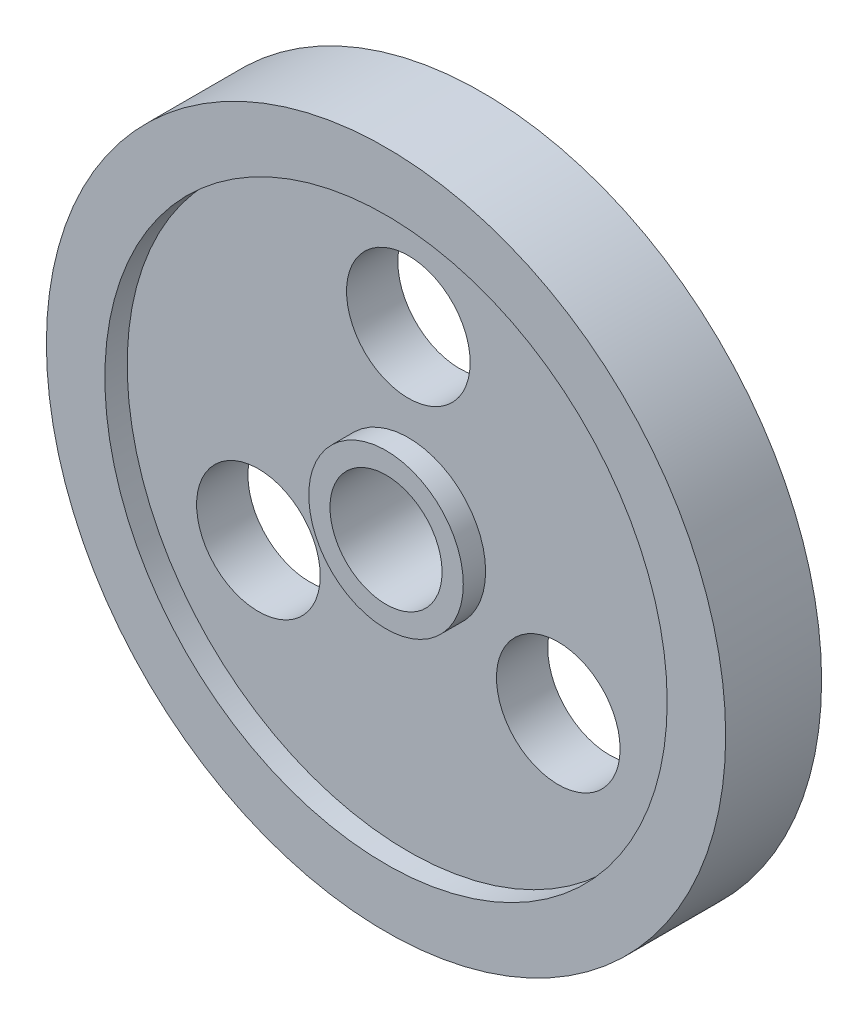
ISO-10303-21;
HEADER;
FILE_DESCRIPTION(('STEP AP214'),'2;1');
FILE_NAME('part.step','',(''),(''),'','','');
FILE_SCHEMA(('AUTOMOTIVE_DESIGN { 1 0 10303 214 1 1 1 1 }'));
ENDSEC;
DATA;
#1=APPLICATION_CONTEXT('core data for automotive mechanical design processes');
#2=APPLICATION_PROTOCOL_DEFINITION('international standard','automotive_design',2000,#1);
#3=PRODUCT_CONTEXT('',#1,'mechanical');
#4=PRODUCT('Part','Part','',(#3));
#5=PRODUCT_RELATED_PRODUCT_CATEGORY('part','',(#4));
#6=PRODUCT_DEFINITION_FORMATION('','',#4);
#7=PRODUCT_DEFINITION_CONTEXT('part definition',#1,'design');
#8=PRODUCT_DEFINITION('design','',#6,#7);
#9=PRODUCT_DEFINITION_SHAPE('','',#8);
#10=(LENGTH_UNIT() NAMED_UNIT(*) SI_UNIT(.MILLI.,.METRE.));
#11=(NAMED_UNIT(*) PLANE_ANGLE_UNIT() SI_UNIT($,.RADIAN.));
#12=(NAMED_UNIT(*) SI_UNIT($,.STERADIAN.) SOLID_ANGLE_UNIT());
#13=UNCERTAINTY_MEASURE_WITH_UNIT(LENGTH_MEASURE(1.E-05),#10,'distance_accuracy_value','');
#14=(GEOMETRIC_REPRESENTATION_CONTEXT(3) GLOBAL_UNCERTAINTY_ASSIGNED_CONTEXT((#13)) GLOBAL_UNIT_ASSIGNED_CONTEXT((#10,
#11,#12)) REPRESENTATION_CONTEXT('',''));
#15=CARTESIAN_POINT('',(0.,0.,0.));
#16=DIRECTION('',(0.,0.,1.));
#17=DIRECTION('',(1.,0.,0.));
#18=AXIS2_PLACEMENT_3D('',#15,#16,#17);
#19=CARTESIAN_POINT('',(0.,0.,-2.794));
#20=DIRECTION('',(0.,0.,1.));
#21=DIRECTION('',(1.,0.,0.));
#22=AXIS2_PLACEMENT_3D('',#19,#20,#21);
#23=PLANE('',#22);
#24=CARTESIAN_POINT('',(0.,0.,-2.794));
#25=DIRECTION('',(0.,0.,1.));
#26=DIRECTION('',(1.,0.,0.));
#27=AXIS2_PLACEMENT_3D('',#24,#25,#26);
#28=CIRCLE('',#27,3.2639);
#29=CARTESIAN_POINT('',(3.2639,0.,-2.794));
#30=VERTEX_POINT('',#29);
#31=EDGE_CURVE('E61',#30,#30,#28,.T.);
#32=ORIENTED_EDGE('',*,*,#31,.T.);
#33=EDGE_LOOP('',(#32));
#34=FACE_BOUND('',#33,.T.);
#35=CARTESIAN_POINT('',(0.,0.,-2.794));
#36=DIRECTION('',(0.,0.,1.));
#37=DIRECTION('',(1.,0.,0.));
#38=AXIS2_PLACEMENT_3D('',#35,#36,#37);
#39=CIRCLE('',#38,4.5);
#40=CARTESIAN_POINT('',(4.5,0.,-2.794));
#41=VERTEX_POINT('',#40);
#42=EDGE_CURVE('E75',#41,#41,#39,.T.);
#43=ORIENTED_EDGE('',*,*,#42,.F.);
#44=EDGE_LOOP('',(#43));
#45=FACE_BOUND('',#44,.T.);
#46=ADVANCED_FACE('F41',(#34,#45),#23,.F.);
#47=CARTESIAN_POINT('',(0.,0.,2.794));
#48=DIRECTION('',(0.,0.,1.));
#49=DIRECTION('',(1.,0.,0.));
#50=AXIS2_PLACEMENT_3D('',#47,#48,#49);
#51=PLANE('',#50);
#52=CARTESIAN_POINT('',(0.,0.,2.794));
#53=DIRECTION('',(0.,0.,1.));
#54=DIRECTION('',(1.,0.,0.));
#55=AXIS2_PLACEMENT_3D('',#52,#53,#54);
#56=CIRCLE('',#55,3.2639);
#57=CARTESIAN_POINT('',(3.2639,0.,2.794));
#58=VERTEX_POINT('',#57);
#59=EDGE_CURVE('E58',#58,#58,#56,.T.);
#60=ORIENTED_EDGE('',*,*,#59,.F.);
#61=EDGE_LOOP('',(#60));
#62=FACE_BOUND('',#61,.T.);
#63=CARTESIAN_POINT('',(0.,0.,2.794));
#64=DIRECTION('',(0.,0.,1.));
#65=DIRECTION('',(1.,0.,0.));
#66=AXIS2_PLACEMENT_3D('',#63,#64,#65);
#67=CIRCLE('',#66,4.5);
#68=CARTESIAN_POINT('',(4.5,0.,2.794));
#69=VERTEX_POINT('',#68);
#70=EDGE_CURVE('E95',#69,#69,#67,.T.);
#71=ORIENTED_EDGE('',*,*,#70,.T.);
#72=EDGE_LOOP('',(#71));
#73=FACE_BOUND('',#72,.T.);
#74=ADVANCED_FACE('F137',(#62,#73),#51,.T.);
#75=CARTESIAN_POINT('',(0.,0.,2.794));
#76=DIRECTION('',(0.,0.,1.));
#77=DIRECTION('',(1.,0.,0.));
#78=AXIS2_PLACEMENT_3D('',#75,#76,#77);
#79=CIRCLE('',#78,16.375);
#80=CARTESIAN_POINT('',(16.375,0.,2.794));
#81=VERTEX_POINT('',#80);
#82=EDGE_CURVE('E103',#81,#81,#79,.T.);
#83=ORIENTED_EDGE('',*,*,#82,.F.);
#84=EDGE_LOOP('',(#83));
#85=FACE_BOUND('',#84,.T.);
#86=CARTESIAN_POINT('',(0.,0.,2.794));
#87=DIRECTION('',(0.,0.,1.));
#88=DIRECTION('',(1.,0.,0.));
#89=AXIS2_PLACEMENT_3D('',#86,#87,#88);
#90=CIRCLE('',#89,19.78095238);
#91=CARTESIAN_POINT('',(19.78095238,0.,2.794));
#92=VERTEX_POINT('',#91);
#93=EDGE_CURVE('E10',#92,#92,#90,.T.);
#94=ORIENTED_EDGE('',*,*,#93,.T.);
#95=EDGE_LOOP('',(#94));
#96=FACE_BOUND('',#95,.T.);
#97=ADVANCED_FACE('F143',(#85,#96),#51,.T.);
#98=CARTESIAN_POINT('',(0.,0.,-2.794));
#99=DIRECTION('',(0.,0.,1.));
#100=DIRECTION('',(1.,0.,0.));
#101=AXIS2_PLACEMENT_3D('',#98,#99,#100);
#102=CIRCLE('',#101,16.375);
#103=CARTESIAN_POINT('',(16.375,0.,-2.794));
#104=VERTEX_POINT('',#103);
#105=EDGE_CURVE('E87',#104,#104,#102,.T.);
#106=ORIENTED_EDGE('',*,*,#105,.T.);
#107=EDGE_LOOP('',(#106));
#108=FACE_BOUND('',#107,.T.);
#109=CARTESIAN_POINT('',(0.,0.,-2.794));
#110=DIRECTION('',(0.,0.,1.));
#111=DIRECTION('',(1.,0.,0.));
#112=AXIS2_PLACEMENT_3D('',#109,#110,#111);
#113=CIRCLE('',#112,19.78095238);
#114=CARTESIAN_POINT('',(19.78095238,0.,-2.794));
#115=VERTEX_POINT('',#114);
#116=EDGE_CURVE('E50',#115,#115,#113,.T.);
#117=ORIENTED_EDGE('',*,*,#116,.F.);
#118=EDGE_LOOP('',(#117));
#119=FACE_BOUND('',#118,.T.);
#120=ADVANCED_FACE('F133',(#108,#119),#23,.F.);
#121=CARTESIAN_POINT('',(0.,0.,2.794));
#122=DIRECTION('',(0.,0.,-1.));
#123=DIRECTION('',(-1.,0.,0.));
#124=AXIS2_PLACEMENT_3D('',#121,#122,#123);
#125=CYLINDRICAL_SURFACE('',#124,19.78095238);
#126=ORIENTED_EDGE('',*,*,#93,.F.);
#127=EDGE_LOOP('',(#126));
#128=FACE_BOUND('',#127,.T.);
#129=ORIENTED_EDGE('',*,*,#116,.T.);
#130=EDGE_LOOP('',(#129));
#131=FACE_BOUND('',#130,.T.);
#132=ADVANCED_FACE('F43',(#128,#131),#125,.T.);
#133=CARTESIAN_POINT('',(0.,0.,2.794));
#134=DIRECTION('',(0.,0.,-1.));
#135=DIRECTION('',(-1.,0.,0.));
#136=AXIS2_PLACEMENT_3D('',#133,#134,#135);
#137=CYLINDRICAL_SURFACE('',#136,3.2639);
#138=ORIENTED_EDGE('',*,*,#59,.T.);
#139=EDGE_LOOP('',(#138));
#140=FACE_BOUND('',#139,.T.);
#141=ORIENTED_EDGE('',*,*,#31,.F.);
#142=EDGE_LOOP('',(#141));
#143=FACE_BOUND('',#142,.T.);
#144=ADVANCED_FACE('F120',(#140,#143),#137,.F.);
#145=CARTESIAN_POINT('',(0.,0.,1.494));
#146=DIRECTION('',(0.,0.,1.));
#147=DIRECTION('',(1.,0.,0.));
#148=AXIS2_PLACEMENT_3D('',#145,#146,#147);
#149=CYLINDRICAL_SURFACE('',#148,16.375);
#150=CARTESIAN_POINT('',(0.,0.,1.494));
#151=DIRECTION('',(0.,0.,1.));
#152=DIRECTION('',(1.,0.,0.));
#153=AXIS2_PLACEMENT_3D('',#150,#151,#152);
#154=CIRCLE('',#153,16.375);
#155=CARTESIAN_POINT('',(16.375,0.,1.494));
#156=VERTEX_POINT('',#155);
#157=EDGE_CURVE('E107',#156,#156,#154,.T.);
#158=ORIENTED_EDGE('',*,*,#157,.F.);
#159=EDGE_LOOP('',(#158));
#160=FACE_BOUND('',#159,.T.);
#161=ORIENTED_EDGE('',*,*,#82,.T.);
#162=EDGE_LOOP('',(#161));
#163=FACE_BOUND('',#162,.T.);
#164=ADVANCED_FACE('F122',(#160,#163),#149,.F.);
#165=CARTESIAN_POINT('',(0.,0.,1.494));
#166=DIRECTION('',(0.,0.,1.));
#167=DIRECTION('',(1.,0.,0.));
#168=AXIS2_PLACEMENT_3D('',#165,#166,#167);
#169=PLANE('',#168);
#170=CARTESIAN_POINT('',(-8.731699961,-5.04124932296639,1.494));
#171=DIRECTION('',(0.,0.,1.));
#172=DIRECTION('',(1.,0.,0.));
#173=AXIS2_PLACEMENT_3D('',#170,#171,#172);
#174=CIRCLE('',#173,3.600000039);
#175=CARTESIAN_POINT('',(-5.131699922,-5.04124932296639,1.494));
#176=VERTEX_POINT('',#175);
#177=EDGE_CURVE('E68',#176,#176,#174,.T.);
#178=ORIENTED_EDGE('',*,*,#177,.F.);
#179=EDGE_LOOP('',(#178));
#180=FACE_BOUND('',#179,.T.);
#181=CARTESIAN_POINT('',(8.731699961,-5.04124932296639,1.494));
#182=DIRECTION('',(0.,0.,1.));
#183=DIRECTION('',(1.,0.,0.));
#184=AXIS2_PLACEMENT_3D('',#181,#182,#183);
#185=CIRCLE('',#184,3.60000003900001);
#186=CARTESIAN_POINT('',(12.3317,-5.04124932296639,1.494));
#187=VERTEX_POINT('',#186);
#188=EDGE_CURVE('E183',#187,#187,#185,.T.);
#189=ORIENTED_EDGE('',*,*,#188,.F.);
#190=EDGE_LOOP('',(#189));
#191=FACE_BOUND('',#190,.T.);
#192=CARTESIAN_POINT('',(0.,10.0824986459328,1.494));
#193=DIRECTION('',(0.,0.,1.));
#194=DIRECTION('',(1.,0.,0.));
#195=AXIS2_PLACEMENT_3D('',#192,#193,#194);
#196=CIRCLE('',#195,3.60000003900001);
#197=CARTESIAN_POINT('',(3.60000003900001,10.0824986459328,1.494));
#198=VERTEX_POINT('',#197);
#199=EDGE_CURVE('E187',#198,#198,#196,.T.);
#200=ORIENTED_EDGE('',*,*,#199,.F.);
#201=EDGE_LOOP('',(#200));
#202=FACE_BOUND('',#201,.T.);
#203=CARTESIAN_POINT('',(0.,0.,1.494));
#204=DIRECTION('',(0.,0.,1.));
#205=DIRECTION('',(1.,0.,0.));
#206=AXIS2_PLACEMENT_3D('',#203,#204,#205);
#207=CIRCLE('',#206,4.5);
#208=CARTESIAN_POINT('',(4.5,0.,1.494));
#209=VERTEX_POINT('',#208);
#210=EDGE_CURVE('E99',#209,#209,#207,.T.);
#211=ORIENTED_EDGE('',*,*,#210,.F.);
#212=EDGE_LOOP('',(#211));
#213=FACE_BOUND('',#212,.T.);
#214=ORIENTED_EDGE('',*,*,#157,.T.);
#215=EDGE_LOOP('',(#214));
#216=FACE_BOUND('',#215,.T.);
#217=ADVANCED_FACE('F129',(#180,#191,#202,#213,#216),#169,.T.);
#218=CARTESIAN_POINT('',(0.,0.,1.494));
#219=DIRECTION('',(0.,0.,1.));
#220=DIRECTION('',(1.,0.,0.));
#221=AXIS2_PLACEMENT_3D('',#218,#219,#220);
#222=CYLINDRICAL_SURFACE('',#221,4.5);
#223=ORIENTED_EDGE('',*,*,#210,.T.);
#224=EDGE_LOOP('',(#223));
#225=FACE_BOUND('',#224,.T.);
#226=ORIENTED_EDGE('',*,*,#70,.F.);
#227=EDGE_LOOP('',(#226));
#228=FACE_BOUND('',#227,.T.);
#229=ADVANCED_FACE('F167',(#225,#228),#222,.T.);
#230=CARTESIAN_POINT('',(0.,0.,-1.494));
#231=DIRECTION('',(0.,0.,-1.));
#232=DIRECTION('',(1.,0.,0.));
#233=AXIS2_PLACEMENT_3D('',#230,#231,#232);
#234=PLANE('',#233);
#235=CARTESIAN_POINT('',(-8.731699961,-5.04124932296639,-1.494));
#236=DIRECTION('',(0.,0.,-1.));
#237=DIRECTION('',(-1.,0.,0.));
#238=AXIS2_PLACEMENT_3D('',#235,#236,#237);
#239=CIRCLE('',#238,3.600000039);
#240=CARTESIAN_POINT('',(-12.3317,-5.04124932296639,-1.494));
#241=VERTEX_POINT('',#240);
#242=EDGE_CURVE('E45',#241,#241,#239,.T.);
#243=ORIENTED_EDGE('',*,*,#242,.F.);
#244=EDGE_LOOP('',(#243));
#245=FACE_BOUND('',#244,.T.);
#246=CARTESIAN_POINT('',(8.731699961,-5.04124932296639,-1.494));
#247=DIRECTION('',(0.,0.,-1.));
#248=DIRECTION('',(-1.,0.,0.));
#249=AXIS2_PLACEMENT_3D('',#246,#247,#248);
#250=CIRCLE('',#249,3.60000003900001);
#251=CARTESIAN_POINT('',(5.13169992199999,-5.04124932296639,-1.494));
#252=VERTEX_POINT('',#251);
#253=EDGE_CURVE('E67',#252,#252,#250,.T.);
#254=ORIENTED_EDGE('',*,*,#253,.F.);
#255=EDGE_LOOP('',(#254));
#256=FACE_BOUND('',#255,.T.);
#257=CARTESIAN_POINT('',(0.,10.0824986459328,-1.494));
#258=DIRECTION('',(0.,0.,-1.));
#259=DIRECTION('',(-1.,0.,0.));
#260=AXIS2_PLACEMENT_3D('',#257,#258,#259);
#261=CIRCLE('',#260,3.60000003900001);
#262=CARTESIAN_POINT('',(-3.60000003900001,10.0824986459328,-1.494));
#263=VERTEX_POINT('',#262);
#264=EDGE_CURVE('E64',#263,#263,#261,.T.);
#265=ORIENTED_EDGE('',*,*,#264,.F.);
#266=EDGE_LOOP('',(#265));
#267=FACE_BOUND('',#266,.T.);
#268=CARTESIAN_POINT('',(0.,0.,-1.494));
#269=DIRECTION('',(0.,0.,1.));
#270=DIRECTION('',(1.,0.,0.));
#271=AXIS2_PLACEMENT_3D('',#268,#269,#270);
#272=CIRCLE('',#271,16.375);
#273=CARTESIAN_POINT('',(16.375,0.,-1.494));
#274=VERTEX_POINT('',#273);
#275=EDGE_CURVE('E91',#274,#274,#272,.T.);
#276=ORIENTED_EDGE('',*,*,#275,.F.);
#277=EDGE_LOOP('',(#276));
#278=FACE_BOUND('',#277,.T.);
#279=CARTESIAN_POINT('',(0.,0.,-1.494));
#280=DIRECTION('',(0.,0.,1.));
#281=DIRECTION('',(1.,0.,0.));
#282=AXIS2_PLACEMENT_3D('',#279,#280,#281);
#283=CIRCLE('',#282,4.5);
#284=CARTESIAN_POINT('',(4.5,0.,-1.494));
#285=VERTEX_POINT('',#284);
#286=EDGE_CURVE('E80',#285,#285,#283,.T.);
#287=ORIENTED_EDGE('',*,*,#286,.T.);
#288=EDGE_LOOP('',(#287));
#289=FACE_BOUND('',#288,.T.);
#290=ADVANCED_FACE('F157',(#245,#256,#267,#278,#289),#234,.T.);
#291=CARTESIAN_POINT('',(0.,0.,-1.494));
#292=DIRECTION('',(0.,0.,-1.));
#293=DIRECTION('',(-1.,0.,0.));
#294=AXIS2_PLACEMENT_3D('',#291,#292,#293);
#295=CYLINDRICAL_SURFACE('',#294,16.375);
#296=ORIENTED_EDGE('',*,*,#275,.T.);
#297=EDGE_LOOP('',(#296));
#298=FACE_BOUND('',#297,.T.);
#299=ORIENTED_EDGE('',*,*,#105,.F.);
#300=EDGE_LOOP('',(#299));
#301=FACE_BOUND('',#300,.T.);
#302=ADVANCED_FACE('F154',(#298,#301),#295,.F.);
#303=CARTESIAN_POINT('',(0.,0.,-1.494));
#304=DIRECTION('',(0.,0.,-1.));
#305=DIRECTION('',(-1.,0.,0.));
#306=AXIS2_PLACEMENT_3D('',#303,#304,#305);
#307=CYLINDRICAL_SURFACE('',#306,4.5);
#308=ORIENTED_EDGE('',*,*,#286,.F.);
#309=EDGE_LOOP('',(#308));
#310=FACE_BOUND('',#309,.T.);
#311=ORIENTED_EDGE('',*,*,#42,.T.);
#312=EDGE_LOOP('',(#311));
#313=FACE_BOUND('',#312,.T.);
#314=ADVANCED_FACE('F156',(#310,#313),#307,.T.);
#315=CARTESIAN_POINT('',(0.,10.0824986459328,-2.794));
#316=DIRECTION('',(0.,0.,1.));
#317=DIRECTION('',(1.,0.,0.));
#318=AXIS2_PLACEMENT_3D('',#315,#316,#317);
#319=CYLINDRICAL_SURFACE('',#318,3.60000003900001);
#320=ORIENTED_EDGE('',*,*,#264,.T.);
#321=EDGE_LOOP('',(#320));
#322=FACE_BOUND('',#321,.T.);
#323=ORIENTED_EDGE('',*,*,#199,.T.);
#324=EDGE_LOOP('',(#323));
#325=FACE_BOUND('',#324,.T.);
#326=ADVANCED_FACE('F163',(#322,#325),#319,.F.);
#327=CARTESIAN_POINT('',(8.731699961,-5.04124932296639,-2.794));
#328=DIRECTION('',(0.,0.,1.));
#329=DIRECTION('',(1.,0.,0.));
#330=AXIS2_PLACEMENT_3D('',#327,#328,#329);
#331=CYLINDRICAL_SURFACE('',#330,3.60000003900001);
#332=ORIENTED_EDGE('',*,*,#253,.T.);
#333=EDGE_LOOP('',(#332));
#334=FACE_BOUND('',#333,.T.);
#335=ORIENTED_EDGE('',*,*,#188,.T.);
#336=EDGE_LOOP('',(#335));
#337=FACE_BOUND('',#336,.T.);
#338=ADVANCED_FACE('F205',(#334,#337),#331,.F.);
#339=CARTESIAN_POINT('',(-8.731699961,-5.04124932296639,-2.794));
#340=DIRECTION('',(0.,0.,1.));
#341=DIRECTION('',(1.,0.,0.));
#342=AXIS2_PLACEMENT_3D('',#339,#340,#341);
#343=CYLINDRICAL_SURFACE('',#342,3.600000039);
#344=ORIENTED_EDGE('',*,*,#242,.T.);
#345=EDGE_LOOP('',(#344));
#346=FACE_BOUND('',#345,.T.);
#347=ORIENTED_EDGE('',*,*,#177,.T.);
#348=EDGE_LOOP('',(#347));
#349=FACE_BOUND('',#348,.T.);
#350=ADVANCED_FACE('F203',(#346,#349),#343,.F.);
#351=CLOSED_SHELL('',(#46,#74,#97,#120,#132,#144,#164,#217,#229,#290,#302,#314,#326,#338,#350));
#352=MANIFOLD_SOLID_BREP('B2',#351);
#353=ADVANCED_BREP_SHAPE_REPRESENTATION('',(#18,#352),#14);
#354=SHAPE_DEFINITION_REPRESENTATION(#9,#353);
ENDSEC;
END-ISO-10303-21;
